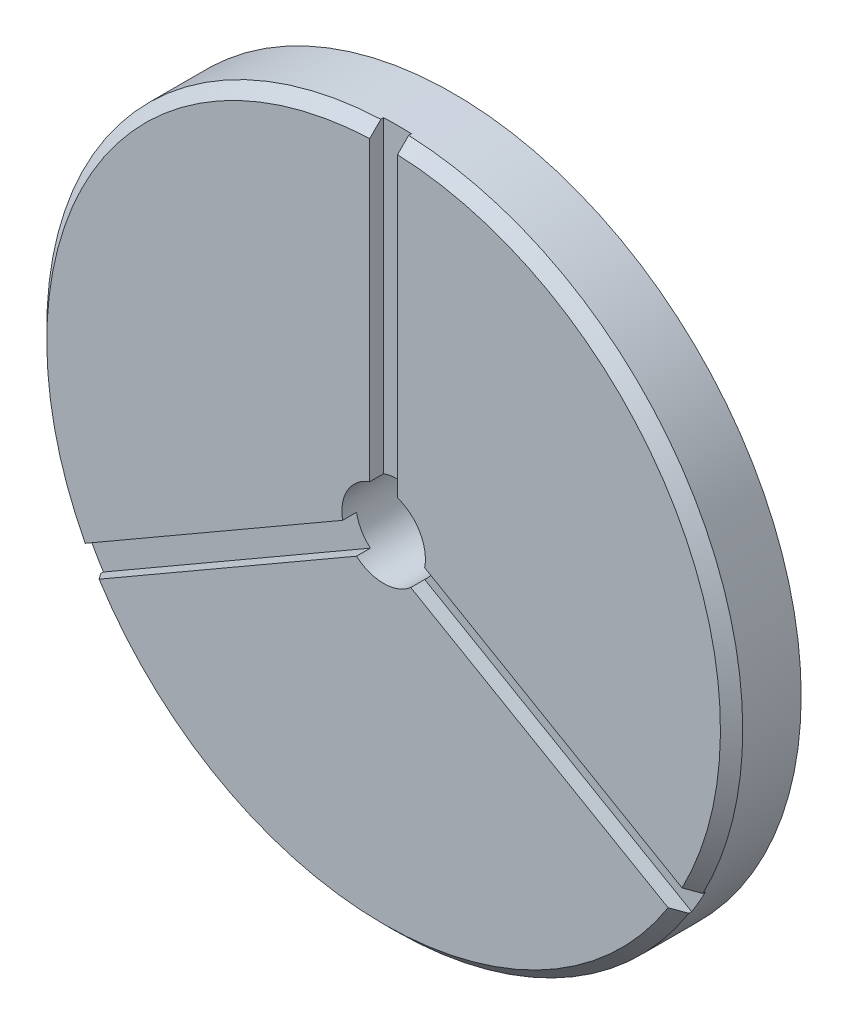
ISO-10303-21;
HEADER;
FILE_DESCRIPTION(('STEP AP214'),'2;1');
FILE_NAME('part.step','',(''),(''),'','','');
FILE_SCHEMA(('AUTOMOTIVE_DESIGN { 1 0 10303 214 1 1 1 1 }'));
ENDSEC;
DATA;
#1=APPLICATION_CONTEXT('core data for automotive mechanical design processes');
#2=APPLICATION_PROTOCOL_DEFINITION('international standard','automotive_design',2000,#1);
#3=PRODUCT_CONTEXT('',#1,'mechanical');
#4=PRODUCT('Part','Part','',(#3));
#5=PRODUCT_RELATED_PRODUCT_CATEGORY('part','',(#4));
#6=PRODUCT_DEFINITION_FORMATION('','',#4);
#7=PRODUCT_DEFINITION_CONTEXT('part definition',#1,'design');
#8=PRODUCT_DEFINITION('design','',#6,#7);
#9=PRODUCT_DEFINITION_SHAPE('','',#8);
#10=(LENGTH_UNIT() NAMED_UNIT(*) SI_UNIT(.MILLI.,.METRE.));
#11=(NAMED_UNIT(*) PLANE_ANGLE_UNIT() SI_UNIT($,.RADIAN.));
#12=(NAMED_UNIT(*) SI_UNIT($,.STERADIAN.) SOLID_ANGLE_UNIT());
#13=UNCERTAINTY_MEASURE_WITH_UNIT(LENGTH_MEASURE(1.E-05),#10,'distance_accuracy_value','');
#14=(GEOMETRIC_REPRESENTATION_CONTEXT(3) GLOBAL_UNCERTAINTY_ASSIGNED_CONTEXT((#13)) GLOBAL_UNIT_ASSIGNED_CONTEXT((#10,
#11,#12)) REPRESENTATION_CONTEXT('',''));
#15=CARTESIAN_POINT('',(0.,0.,0.));
#16=DIRECTION('',(0.,0.,1.));
#17=DIRECTION('',(1.,0.,0.));
#18=AXIS2_PLACEMENT_3D('',#15,#16,#17);
#19=CARTESIAN_POINT('',(0.,0.,0.));
#20=DIRECTION('',(0.,0.,-1.));
#21=DIRECTION('',(0.5,0.866025403784438,0.));
#22=AXIS2_PLACEMENT_3D('',#19,#20,#21);
#23=PLANE('',#22);
#24=DIRECTION('',(0.,-1.,0.));
#25=VECTOR('',#24,1.);
#26=CARTESIAN_POINT('',(-10.,249.799919935936,0.));
#27=LINE('',#26,#25);
#28=CARTESIAN_POINT('',(-10.,249.799919935936,0.));
#29=VERTEX_POINT('',#28);
#30=CARTESIAN_POINT('',(-10.,28.2842712474619,0.));
#31=VERTEX_POINT('',#30);
#32=EDGE_CURVE('E173',#29,#31,#27,.T.);
#33=ORIENTED_EDGE('',*,*,#32,.T.);
#34=CARTESIAN_POINT('',(0.,0.,0.));
#35=DIRECTION('',(0.,0.,1.));
#36=DIRECTION('',(1.,0.,0.));
#37=AXIS2_PLACEMENT_3D('',#34,#35,#36);
#38=CIRCLE('',#37,30.);
#39=CARTESIAN_POINT('',(10.,28.2842712474619,0.));
#40=VERTEX_POINT('',#39);
#41=EDGE_CURVE('E166',#40,#31,#38,.T.);
#42=ORIENTED_EDGE('',*,*,#41,.F.);
#43=DIRECTION('',(0.,1.,0.));
#44=VECTOR('',#43,1.);
#45=CARTESIAN_POINT('',(10.,28.2842712474619,0.));
#46=LINE('',#45,#44);
#47=CARTESIAN_POINT('',(10.,249.799919935936,0.));
#48=VERTEX_POINT('',#47);
#49=EDGE_CURVE('E170',#40,#48,#46,.T.);
#50=ORIENTED_EDGE('',*,*,#49,.T.);
#51=CARTESIAN_POINT('',(0.,0.,0.));
#52=DIRECTION('',(0.,0.,1.));
#53=DIRECTION('',(1.,0.,0.));
#54=AXIS2_PLACEMENT_3D('',#51,#52,#53);
#55=CIRCLE('',#54,250.);
#56=EDGE_CURVE('E198',#48,#29,#55,.T.);
#57=ORIENTED_EDGE('',*,*,#56,.T.);
#58=EDGE_LOOP('',(#33,#42,#50,#57));
#59=FACE_BOUND('',#58,.T.);
#60=ADVANCED_FACE('F17',(#59),#23,.F.);
#61=DIRECTION('',(-0.866025403784438,0.5,0.));
#62=VECTOR('',#61,1.);
#63=CARTESIAN_POINT('',(221.333076527839,-116.239705930124,0.));
#64=LINE('',#63,#62);
#65=CARTESIAN_POINT('',(221.333076527839,-116.239705930124,0.));
#66=VERTEX_POINT('',#65);
#67=CARTESIAN_POINT('',(29.4948974278318,-5.48188158588659,0.));
#68=VERTEX_POINT('',#67);
#69=EDGE_CURVE('E261',#66,#68,#64,.T.);
#70=ORIENTED_EDGE('',*,*,#69,.T.);
#71=CARTESIAN_POINT('',(19.4948974278317,-22.8023896615754,0.));
#72=VERTEX_POINT('',#71);
#73=EDGE_CURVE('E180',#72,#68,#38,.T.);
#74=ORIENTED_EDGE('',*,*,#73,.F.);
#75=DIRECTION('',(0.866025403784438,-0.5,0.));
#76=VECTOR('',#75,1.);
#77=CARTESIAN_POINT('',(19.4948974278317,-22.8023896615754,0.));
#78=LINE('',#77,#76);
#79=CARTESIAN_POINT('',(211.333076527839,-133.560214005812,0.));
#80=VERTEX_POINT('',#79);
#81=EDGE_CURVE('E255',#72,#80,#78,.T.);
#82=ORIENTED_EDGE('',*,*,#81,.T.);
#83=CARTESIAN_POINT('',(0.,0.,0.));
#84=DIRECTION('',(0.,0.,1.));
#85=DIRECTION('',(-0.5,-0.866025403784438,0.));
#86=AXIS2_PLACEMENT_3D('',#83,#84,#85);
#87=CIRCLE('',#86,250.);
#88=EDGE_CURVE('E269',#80,#66,#87,.T.);
#89=ORIENTED_EDGE('',*,*,#88,.T.);
#90=EDGE_LOOP('',(#70,#74,#82,#89));
#91=FACE_BOUND('',#90,.T.);
#92=ADVANCED_FACE('F416',(#91),#23,.F.);
#93=CARTESIAN_POINT('',(0.,0.,10.));
#94=DIRECTION('',(0.,0.,1.));
#95=DIRECTION('',(1.,0.,0.));
#96=AXIS2_PLACEMENT_3D('',#93,#94,#95);
#97=PLANE('',#96);
#98=DIRECTION('',(0.866025403784438,-0.5,0.));
#99=VECTOR('',#98,1.);
#100=CARTESIAN_POINT('',(19.4948974278317,-22.8023896615754,10.));
#101=LINE('',#100,#99);
#102=CARTESIAN_POINT('',(19.4948974278317,-22.8023896615754,10.));
#103=VERTEX_POINT('',#102);
#104=CARTESIAN_POINT('',(204.399140399382,-129.556904115504,10.));
#105=VERTEX_POINT('',#104);
#106=EDGE_CURVE('E256',#103,#105,#101,.T.);
#107=ORIENTED_EDGE('',*,*,#106,.F.);
#108=CARTESIAN_POINT('',(0.,0.,10.));
#109=DIRECTION('',(0.,0.,1.));
#110=DIRECTION('',(1.,0.,0.));
#111=AXIS2_PLACEMENT_3D('',#108,#109,#110);
#112=CIRCLE('',#111,30.);
#113=CARTESIAN_POINT('',(-19.4948974278318,-22.8023896615754,10.));
#114=VERTEX_POINT('',#113);
#115=EDGE_CURVE('E205',#114,#103,#112,.T.);
#116=ORIENTED_EDGE('',*,*,#115,.F.);
#117=DIRECTION('',(0.866025403784439,0.5,0.));
#118=VECTOR('',#117,1.);
#119=CARTESIAN_POINT('',(-211.333076527839,-133.560214005812,10.));
#120=LINE('',#119,#118);
#121=CARTESIAN_POINT('',(-204.399140399382,-129.556904115504,10.));
#122=VERTEX_POINT('',#121);
#123=EDGE_CURVE('E226',#122,#114,#120,.T.);
#124=ORIENTED_EDGE('',*,*,#123,.F.);
#125=CARTESIAN_POINT('',(0.,0.,10.));
#126=DIRECTION('',(0.,0.,1.));
#127=DIRECTION('',(1.,0.,0.));
#128=AXIS2_PLACEMENT_3D('',#125,#126,#127);
#129=CIRCLE('',#128,242.);
#130=EDGE_CURVE('E296',#122,#105,#129,.T.);
#131=ORIENTED_EDGE('',*,*,#130,.T.);
#132=EDGE_LOOP('',(#107,#116,#124,#131));
#133=FACE_BOUND('',#132,.T.);
#134=ADVANCED_FACE('F421',(#133),#97,.T.);
#135=DIRECTION('',(-0.866025403784439,-0.5,0.));
#136=VECTOR('',#135,1.);
#137=CARTESIAN_POINT('',(-29.4948974278318,-5.48188158588656,10.));
#138=LINE('',#137,#136);
#139=CARTESIAN_POINT('',(-29.4948974278318,-5.48188158588656,10.));
#140=VERTEX_POINT('',#139);
#141=CARTESIAN_POINT('',(-214.399140399382,-112.236396039815,10.));
#142=VERTEX_POINT('',#141);
#143=EDGE_CURVE('E222',#140,#142,#138,.T.);
#144=ORIENTED_EDGE('',*,*,#143,.F.);
#145=CARTESIAN_POINT('',(-10.,28.2842712474619,10.));
#146=VERTEX_POINT('',#145);
#147=EDGE_CURVE('E199',#146,#140,#112,.T.);
#148=ORIENTED_EDGE('',*,*,#147,.F.);
#149=DIRECTION('',(0.,-1.,0.));
#150=VECTOR('',#149,1.);
#151=CARTESIAN_POINT('',(-10.,249.799919935936,10.));
#152=LINE('',#151,#150);
#153=CARTESIAN_POINT('',(-10.,241.793300155318,10.));
#154=VERTEX_POINT('',#153);
#155=EDGE_CURVE('E208',#154,#146,#152,.T.);
#156=ORIENTED_EDGE('',*,*,#155,.F.);
#157=CARTESIAN_POINT('',(0.,0.,10.));
#158=DIRECTION('',(0.,0.,1.));
#159=DIRECTION('',(1.,0.,0.));
#160=AXIS2_PLACEMENT_3D('',#157,#158,#159);
#161=CIRCLE('',#160,242.);
#162=EDGE_CURVE('E300',#154,#142,#161,.T.);
#163=ORIENTED_EDGE('',*,*,#162,.T.);
#164=EDGE_LOOP('',(#144,#148,#156,#163));
#165=FACE_BOUND('',#164,.T.);
#166=ADVANCED_FACE('F441',(#165),#97,.T.);
#167=DIRECTION('',(0.,1.,0.));
#168=VECTOR('',#167,1.);
#169=CARTESIAN_POINT('',(10.,28.2842712474619,10.));
#170=LINE('',#169,#168);
#171=CARTESIAN_POINT('',(10.,28.2842712474619,10.));
#172=VERTEX_POINT('',#171);
#173=CARTESIAN_POINT('',(10.,241.793300155318,10.));
#174=VERTEX_POINT('',#173);
#175=EDGE_CURVE('E213',#172,#174,#170,.T.);
#176=ORIENTED_EDGE('',*,*,#175,.F.);
#177=CARTESIAN_POINT('',(29.4948974278318,-5.48188158588658,10.));
#178=VERTEX_POINT('',#177);
#179=EDGE_CURVE('E187',#178,#172,#112,.T.);
#180=ORIENTED_EDGE('',*,*,#179,.F.);
#181=DIRECTION('',(-0.866025403784438,0.5,0.));
#182=VECTOR('',#181,1.);
#183=CARTESIAN_POINT('',(221.333076527839,-116.239705930124,10.));
#184=LINE('',#183,#182);
#185=CARTESIAN_POINT('',(214.399140399382,-112.236396039815,10.));
#186=VERTEX_POINT('',#185);
#187=EDGE_CURVE('E260',#186,#178,#184,.T.);
#188=ORIENTED_EDGE('',*,*,#187,.F.);
#189=CARTESIAN_POINT('',(0.,0.,10.));
#190=DIRECTION('',(0.,0.,1.));
#191=DIRECTION('',(1.,0.,0.));
#192=AXIS2_PLACEMENT_3D('',#189,#190,#191);
#193=CIRCLE('',#192,242.);
#194=EDGE_CURVE('E292',#186,#174,#193,.T.);
#195=ORIENTED_EDGE('',*,*,#194,.T.);
#196=EDGE_LOOP('',(#176,#180,#188,#195));
#197=FACE_BOUND('',#196,.T.);
#198=ADVANCED_FACE('F396',(#197),#97,.T.);
#199=CARTESIAN_POINT('',(0.,0.,-40.));
#200=DIRECTION('',(0.,0.,1.));
#201=DIRECTION('',(1.,0.,0.));
#202=AXIS2_PLACEMENT_3D('',#199,#200,#201);
#203=CYLINDRICAL_SURFACE('',#202,250.);
#204=CARTESIAN_POINT('',(0.,0.,-40.));
#205=DIRECTION('',(0.,0.,1.));
#206=DIRECTION('',(1.,0.,0.));
#207=AXIS2_PLACEMENT_3D('',#204,#205,#206);
#208=CIRCLE('',#207,250.);
#209=CARTESIAN_POINT('',(250.,0.,-40.));
#210=VERTEX_POINT('',#209);
#211=EDGE_CURVE('E288',#210,#210,#208,.T.);
#212=ORIENTED_EDGE('',*,*,#211,.T.);
#213=EDGE_LOOP('',(#212));
#214=FACE_BOUND('',#213,.T.);
#215=DIRECTION('',(0.,0.,-1.));
#216=VECTOR('',#215,1.);
#217=CARTESIAN_POINT('',(-221.333076527839,-116.239705930123,10.));
#218=LINE('',#217,#216);
#219=CARTESIAN_POINT('',(-221.333076527839,-116.239705930123,2.));
#220=VERTEX_POINT('',#219);
#221=CARTESIAN_POINT('',(-221.333076527839,-116.239705930123,0.));
#222=VERTEX_POINT('',#221);
#223=EDGE_CURVE('E248',#220,#222,#218,.T.);
#224=ORIENTED_EDGE('',*,*,#223,.F.);
#225=CARTESIAN_POINT('',(0.,0.,2.));
#226=DIRECTION('',(0.,0.,1.));
#227=DIRECTION('',(1.,0.,0.));
#228=AXIS2_PLACEMENT_3D('',#225,#226,#227);
#229=CIRCLE('',#228,250.);
#230=CARTESIAN_POINT('',(-10.,249.799919935936,2.));
#231=VERTEX_POINT('',#230);
#232=EDGE_CURVE('E44',#220,#231,#229,.F.);
#233=ORIENTED_EDGE('',*,*,#232,.T.);
#234=DIRECTION('',(0.,0.,-1.));
#235=VECTOR('',#234,1.);
#236=CARTESIAN_POINT('',(-10.,249.799919935936,10.));
#237=LINE('',#236,#235);
#238=EDGE_CURVE('E217',#231,#29,#237,.T.);
#239=ORIENTED_EDGE('',*,*,#238,.T.);
#240=ORIENTED_EDGE('',*,*,#56,.F.);
#241=DIRECTION('',(0.,0.,-1.));
#242=VECTOR('',#241,1.);
#243=CARTESIAN_POINT('',(10.,249.799919935936,10.));
#244=LINE('',#243,#242);
#245=CARTESIAN_POINT('',(10.,249.799919935936,2.));
#246=VERTEX_POINT('',#245);
#247=EDGE_CURVE('E193',#246,#48,#244,.T.);
#248=ORIENTED_EDGE('',*,*,#247,.F.);
#249=CARTESIAN_POINT('',(0.,0.,2.));
#250=DIRECTION('',(0.,0.,1.));
#251=DIRECTION('',(1.,0.,0.));
#252=AXIS2_PLACEMENT_3D('',#249,#250,#251);
#253=CIRCLE('',#252,250.);
#254=CARTESIAN_POINT('',(221.333076527839,-116.239705930124,2.));
#255=VERTEX_POINT('',#254);
#256=EDGE_CURVE('E313',#246,#255,#253,.F.);
#257=ORIENTED_EDGE('',*,*,#256,.T.);
#258=DIRECTION('',(0.,0.,-1.));
#259=VECTOR('',#258,1.);
#260=CARTESIAN_POINT('',(221.333076527839,-116.239705930124,10.));
#261=LINE('',#260,#259);
#262=EDGE_CURVE('E279',#255,#66,#261,.T.);
#263=ORIENTED_EDGE('',*,*,#262,.T.);
#264=ORIENTED_EDGE('',*,*,#88,.F.);
#265=DIRECTION('',(0.,0.,-1.));
#266=VECTOR('',#265,1.);
#267=CARTESIAN_POINT('',(211.333076527839,-133.560214005812,10.));
#268=LINE('',#267,#266);
#269=CARTESIAN_POINT('',(211.333076527839,-133.560214005812,2.));
#270=VERTEX_POINT('',#269);
#271=EDGE_CURVE('E282',#270,#80,#268,.T.);
#272=ORIENTED_EDGE('',*,*,#271,.F.);
#273=CARTESIAN_POINT('',(0.,0.,2.));
#274=DIRECTION('',(0.,0.,1.));
#275=DIRECTION('',(1.,0.,0.));
#276=AXIS2_PLACEMENT_3D('',#273,#274,#275);
#277=CIRCLE('',#276,250.);
#278=CARTESIAN_POINT('',(-211.333076527839,-133.560214005812,2.00000000000003));
#279=VERTEX_POINT('',#278);
#280=EDGE_CURVE('E53',#270,#279,#277,.F.);
#281=ORIENTED_EDGE('',*,*,#280,.T.);
#282=DIRECTION('',(0.,0.,-1.));
#283=VECTOR('',#282,1.);
#284=CARTESIAN_POINT('',(-211.333076527839,-133.560214005812,10.));
#285=LINE('',#284,#283);
#286=CARTESIAN_POINT('',(-211.333076527839,-133.560214005812,0.));
#287=VERTEX_POINT('',#286);
#288=EDGE_CURVE('E245',#279,#287,#285,.T.);
#289=ORIENTED_EDGE('',*,*,#288,.T.);
#290=CARTESIAN_POINT('',(0.,0.,0.));
#291=DIRECTION('',(0.,0.,1.));
#292=DIRECTION('',(-0.5,0.866025403784439,0.));
#293=AXIS2_PLACEMENT_3D('',#290,#291,#292);
#294=CIRCLE('',#293,250.);
#295=EDGE_CURVE('E235',#222,#287,#294,.T.);
#296=ORIENTED_EDGE('',*,*,#295,.F.);
#297=EDGE_LOOP('',(#224,#233,#239,#240,#248,#257,#263,#264,#272,#281,#289,#296));
#298=FACE_BOUND('',#297,.T.);
#299=ADVANCED_FACE('F326',(#214,#298),#203,.T.);
#300=CARTESIAN_POINT('',(0.,0.,-40.));
#301=DIRECTION('',(0.,0.,1.));
#302=DIRECTION('',(1.,0.,0.));
#303=AXIS2_PLACEMENT_3D('',#300,#301,#302);
#304=PLANE('',#303);
#305=CARTESIAN_POINT('',(0.,0.,-40.));
#306=DIRECTION('',(0.,0.,1.));
#307=DIRECTION('',(1.,0.,0.));
#308=AXIS2_PLACEMENT_3D('',#305,#306,#307);
#309=CIRCLE('',#308,30.);
#310=CARTESIAN_POINT('',(30.,0.,-40.));
#311=VERTEX_POINT('',#310);
#312=EDGE_CURVE('E177',#311,#311,#309,.T.);
#313=ORIENTED_EDGE('',*,*,#312,.T.);
#314=EDGE_LOOP('',(#313));
#315=FACE_BOUND('',#314,.T.);
#316=ORIENTED_EDGE('',*,*,#211,.F.);
#317=EDGE_LOOP('',(#316));
#318=FACE_BOUND('',#317,.T.);
#319=ADVANCED_FACE('F408',(#315,#318),#304,.F.);
#320=CARTESIAN_POINT('',(19.4948974278317,-22.8023896615754,10.));
#321=DIRECTION('',(0.5,0.866025403784438,0.));
#322=DIRECTION('',(-0.866025403784438,0.5,0.));
#323=AXIS2_PLACEMENT_3D('',#320,#321,#322);
#324=PLANE('',#323);
#325=ORIENTED_EDGE('',*,*,#106,.T.);
#326=CARTESIAN_POINT('',(204.399140399382,-129.556904115504,10.));
#327=CARTESIAN_POINT('',(205.554811963524,-130.224131404156,8.66668462871758));
#328=CARTESIAN_POINT('',(206.710475756301,-130.891354206008,7.33336027640922));
#329=CARTESIAN_POINT('',(209.02178779912,-132.225790836111,4.66669360974255));
#330=CARTESIAN_POINT('',(210.177436049163,-132.893004664362,3.33335129538425));
#331=CARTESIAN_POINT('',(211.333076527839,-133.560214005812,2.));
#332=B_SPLINE_CURVE_WITH_KNOTS('',3,(#326,#327,#328,#329,#330,#331),.UNSPECIFIED.,.F.,.F.,(4,2,
4),(0.,5.65919517947052,11.3183903589327),.UNSPECIFIED.);
#333=EDGE_CURVE('E340',#105,#270,#332,.T.);
#334=ORIENTED_EDGE('',*,*,#333,.T.);
#335=ORIENTED_EDGE('',*,*,#271,.T.);
#336=ORIENTED_EDGE('',*,*,#81,.F.);
#337=DIRECTION('',(0.,0.,-1.));
#338=VECTOR('',#337,1.);
#339=CARTESIAN_POINT('',(19.4948974278317,-22.8023896615754,10.));
#340=LINE('',#339,#338);
#341=EDGE_CURVE('E285',#103,#72,#340,.T.);
#342=ORIENTED_EDGE('',*,*,#341,.F.);
#343=EDGE_LOOP('',(#325,#334,#335,#336,#342));
#344=FACE_BOUND('',#343,.T.);
#345=ADVANCED_FACE('F374',(#344),#324,.T.);
#346=CARTESIAN_POINT('',(221.333076527839,-116.239705930124,10.));
#347=DIRECTION('',(-0.5,-0.866025403784438,0.));
#348=DIRECTION('',(0.866025403784438,-0.5,0.));
#349=AXIS2_PLACEMENT_3D('',#346,#347,#348);
#350=PLANE('',#349);
#351=ORIENTED_EDGE('',*,*,#262,.F.);
#352=CARTESIAN_POINT('',(221.333076527839,-116.239705930124,2.));
#353=CARTESIAN_POINT('',(220.177436049163,-115.572496588673,3.33335129538425));
#354=CARTESIAN_POINT('',(219.02178779912,-114.905282760422,4.66669360974254));
#355=CARTESIAN_POINT('',(216.710475756301,-113.57084613032,7.33336027640921));
#356=CARTESIAN_POINT('',(215.554811963524,-112.903623328467,8.66668462871758));
#357=CARTESIAN_POINT('',(214.399140399382,-112.236396039815,10.));
#358=B_SPLINE_CURVE_WITH_KNOTS('',3,(#352,#353,#354,#355,#356,#357),.UNSPECIFIED.,.F.,.F.,(4,2,
4),(0.,5.65919517946218,11.3183903589327),.UNSPECIFIED.);
#359=EDGE_CURVE('E11',#255,#186,#358,.T.);
#360=ORIENTED_EDGE('',*,*,#359,.T.);
#361=ORIENTED_EDGE('',*,*,#187,.T.);
#362=DIRECTION('',(0.,0.,-1.));
#363=VECTOR('',#362,1.);
#364=CARTESIAN_POINT('',(29.4948974278318,-5.4818815858866,10.));
#365=LINE('',#364,#363);
#366=EDGE_CURVE('E265',#178,#68,#365,.T.);
#367=ORIENTED_EDGE('',*,*,#366,.T.);
#368=ORIENTED_EDGE('',*,*,#69,.F.);
#369=EDGE_LOOP('',(#351,#360,#361,#367,#368));
#370=FACE_BOUND('',#369,.T.);
#371=ADVANCED_FACE('F392',(#370),#350,.T.);
#372=DIRECTION('',(0.866025403784439,0.5,0.));
#373=VECTOR('',#372,1.);
#374=CARTESIAN_POINT('',(-211.333076527839,-133.560214005812,0.));
#375=LINE('',#374,#373);
#376=CARTESIAN_POINT('',(-19.4948974278318,-22.8023896615753,0.));
#377=VERTEX_POINT('',#376);
#378=EDGE_CURVE('E227',#287,#377,#375,.T.);
#379=ORIENTED_EDGE('',*,*,#378,.T.);
#380=CARTESIAN_POINT('',(-29.4948974278318,-5.48188158588656,0.));
#381=VERTEX_POINT('',#380);
#382=EDGE_CURVE('E178',#381,#377,#38,.T.);
#383=ORIENTED_EDGE('',*,*,#382,.F.);
#384=DIRECTION('',(-0.866025403784439,-0.5,0.));
#385=VECTOR('',#384,1.);
#386=CARTESIAN_POINT('',(-29.4948974278318,-5.48188158588656,0.));
#387=LINE('',#386,#385);
#388=EDGE_CURVE('E192',#381,#222,#387,.T.);
#389=ORIENTED_EDGE('',*,*,#388,.T.);
#390=ORIENTED_EDGE('',*,*,#295,.T.);
#391=EDGE_LOOP('',(#379,#383,#389,#390));
#392=FACE_BOUND('',#391,.T.);
#393=ADVANCED_FACE('F417',(#392),#23,.F.);
#394=CARTESIAN_POINT('',(-29.4948974278318,-5.48188158588656,10.));
#395=DIRECTION('',(0.5,-0.866025403784439,0.));
#396=DIRECTION('',(0.866025403784439,0.5,0.));
#397=AXIS2_PLACEMENT_3D('',#394,#395,#396);
#398=PLANE('',#397);
#399=ORIENTED_EDGE('',*,*,#143,.T.);
#400=CARTESIAN_POINT('',(-214.399140399382,-112.236396039815,10.));
#401=CARTESIAN_POINT('',(-215.554811963524,-112.903623328467,8.66668462871753));
#402=CARTESIAN_POINT('',(-216.710475756301,-113.57084613032,7.33336027640914));
#403=CARTESIAN_POINT('',(-219.02178779912,-114.905282760422,4.66669360974247));
#404=CARTESIAN_POINT('',(-220.177436049163,-115.572496588673,3.3333512953842));
#405=CARTESIAN_POINT('',(-221.333076527839,-116.239705930123,2.));
#406=B_SPLINE_CURVE_WITH_KNOTS('',3,(#400,#401,#402,#403,#404,#405),.UNSPECIFIED.,.F.,.F.,(4,2,
4),(0.,5.65919517947033,11.3183903589323),.UNSPECIFIED.);
#407=EDGE_CURVE('E304',#142,#220,#406,.T.);
#408=ORIENTED_EDGE('',*,*,#407,.T.);
#409=ORIENTED_EDGE('',*,*,#223,.T.);
#410=ORIENTED_EDGE('',*,*,#388,.F.);
#411=DIRECTION('',(0.,0.,-1.));
#412=VECTOR('',#411,1.);
#413=CARTESIAN_POINT('',(-29.4948974278318,-5.48188158588656,10.));
#414=LINE('',#413,#412);
#415=EDGE_CURVE('E251',#140,#381,#414,.T.);
#416=ORIENTED_EDGE('',*,*,#415,.F.);
#417=EDGE_LOOP('',(#399,#408,#409,#410,#416));
#418=FACE_BOUND('',#417,.T.);
#419=ADVANCED_FACE('F315',(#418),#398,.T.);
#420=CARTESIAN_POINT('',(-211.333076527839,-133.560214005812,10.));
#421=DIRECTION('',(-0.5,0.866025403784439,0.));
#422=DIRECTION('',(-0.866025403784439,-0.5,0.));
#423=AXIS2_PLACEMENT_3D('',#420,#421,#422);
#424=PLANE('',#423);
#425=ORIENTED_EDGE('',*,*,#288,.F.);
#426=CARTESIAN_POINT('',(-211.333076527839,-133.560214005812,2.));
#427=CARTESIAN_POINT('',(-210.177436049163,-132.893004664362,3.33335129538421));
#428=CARTESIAN_POINT('',(-209.02178779912,-132.225790836111,4.66669360974249));
#429=CARTESIAN_POINT('',(-206.710475756301,-130.891354206008,7.33336027640916));
#430=CARTESIAN_POINT('',(-205.554811963524,-130.224131404156,8.66668462871755));
#431=CARTESIAN_POINT('',(-204.399140399382,-129.556904115504,10.));
#432=B_SPLINE_CURVE_WITH_KNOTS('',3,(#426,#427,#428,#429,#430,#431),.UNSPECIFIED.,.F.,.F.,(4,2,
4),(0.,5.65919517946203,11.3183903589324),.UNSPECIFIED.);
#433=EDGE_CURVE('E361',#279,#122,#432,.T.);
#434=ORIENTED_EDGE('',*,*,#433,.T.);
#435=ORIENTED_EDGE('',*,*,#123,.T.);
#436=DIRECTION('',(0.,0.,-1.));
#437=VECTOR('',#436,1.);
#438=CARTESIAN_POINT('',(-19.4948974278318,-22.8023896615754,10.));
#439=LINE('',#438,#437);
#440=EDGE_CURVE('E231',#114,#377,#439,.T.);
#441=ORIENTED_EDGE('',*,*,#440,.T.);
#442=ORIENTED_EDGE('',*,*,#378,.F.);
#443=EDGE_LOOP('',(#425,#434,#435,#441,#442));
#444=FACE_BOUND('',#443,.T.);
#445=ADVANCED_FACE('F354',(#444),#424,.T.);
#446=CARTESIAN_POINT('',(10.,28.2842712474619,10.));
#447=DIRECTION('',(-1.,0.,0.));
#448=DIRECTION('',(0.,-1.,0.));
#449=AXIS2_PLACEMENT_3D('',#446,#447,#448);
#450=PLANE('',#449);
#451=ORIENTED_EDGE('',*,*,#175,.T.);
#452=CARTESIAN_POINT('',(10.,241.793300155318,10.));
#453=CARTESIAN_POINT('',(10.,243.127754732623,8.66668462871758));
#454=CARTESIAN_POINT('',(10.,244.462200336328,7.33336027640921));
#455=CARTESIAN_POINT('',(10.,247.131073596534,4.66669360974255));
#456=CARTESIAN_POINT('',(10.,248.465501253035,3.33335129538425));
#457=CARTESIAN_POINT('',(10.,249.799919935936,2.));
#458=B_SPLINE_CURVE_WITH_KNOTS('',3,(#452,#453,#454,#455,#456,#457),.UNSPECIFIED.,.F.,.F.,(4,2,
4),(0.,5.65919517947045,11.3183903589326),.UNSPECIFIED.);
#459=EDGE_CURVE('E32',#174,#246,#458,.T.);
#460=ORIENTED_EDGE('',*,*,#459,.T.);
#461=ORIENTED_EDGE('',*,*,#247,.T.);
#462=ORIENTED_EDGE('',*,*,#49,.F.);
#463=DIRECTION('',(0.,0.,-1.));
#464=VECTOR('',#463,1.);
#465=CARTESIAN_POINT('',(10.,28.2842712474619,10.));
#466=LINE('',#465,#464);
#467=EDGE_CURVE('E182',#172,#40,#466,.T.);
#468=ORIENTED_EDGE('',*,*,#467,.F.);
#469=EDGE_LOOP('',(#451,#460,#461,#462,#468));
#470=FACE_BOUND('',#469,.T.);
#471=ADVANCED_FACE('F195',(#470),#450,.T.);
#472=CARTESIAN_POINT('',(-10.,249.799919935936,10.));
#473=DIRECTION('',(1.,0.,0.));
#474=DIRECTION('',(0.,1.,0.));
#475=AXIS2_PLACEMENT_3D('',#472,#473,#474);
#476=PLANE('',#475);
#477=ORIENTED_EDGE('',*,*,#238,.F.);
#478=CARTESIAN_POINT('',(-10.,249.799919935936,2.));
#479=CARTESIAN_POINT('',(-10.,248.465501253035,3.33335129538425));
#480=CARTESIAN_POINT('',(-10.,247.131073596534,4.66669360974255));
#481=CARTESIAN_POINT('',(-10.,244.462200336328,7.33336027640921));
#482=CARTESIAN_POINT('',(-10.,243.127754732623,8.66668462871758));
#483=CARTESIAN_POINT('',(-10.,241.793300155318,10.));
#484=B_SPLINE_CURVE_WITH_KNOTS('',3,(#478,#479,#480,#481,#482,#483),.UNSPECIFIED.,.F.,.F.,(4,2,
4),(0.,5.65919517946214,11.3183903589326),.UNSPECIFIED.);
#485=EDGE_CURVE('E331',#231,#154,#484,.T.);
#486=ORIENTED_EDGE('',*,*,#485,.T.);
#487=ORIENTED_EDGE('',*,*,#155,.T.);
#488=DIRECTION('',(0.,0.,-1.));
#489=VECTOR('',#488,1.);
#490=CARTESIAN_POINT('',(-10.,28.2842712474619,10.));
#491=LINE('',#490,#489);
#492=EDGE_CURVE('E214',#146,#31,#491,.T.);
#493=ORIENTED_EDGE('',*,*,#492,.T.);
#494=ORIENTED_EDGE('',*,*,#32,.F.);
#495=EDGE_LOOP('',(#477,#486,#487,#493,#494));
#496=FACE_BOUND('',#495,.T.);
#497=ADVANCED_FACE('F324',(#496),#476,.T.);
#498=CARTESIAN_POINT('',(0.,0.,10.));
#499=DIRECTION('',(0.,0.,-1.));
#500=DIRECTION('',(-1.,0.,0.));
#501=AXIS2_PLACEMENT_3D('',#498,#499,#500);
#502=CONICAL_SURFACE('',#501,242.,0.785398163397449);
#503=ORIENTED_EDGE('',*,*,#485,.F.);
#504=ORIENTED_EDGE('',*,*,#232,.F.);
#505=ORIENTED_EDGE('',*,*,#407,.F.);
#506=ORIENTED_EDGE('',*,*,#162,.F.);
#507=EDGE_LOOP('',(#503,#504,#505,#506));
#508=FACE_BOUND('',#507,.T.);
#509=ADVANCED_FACE('F319',(#508),#502,.T.);
#510=CARTESIAN_POINT('',(0.,0.,10.));
#511=DIRECTION('',(0.,0.,-1.));
#512=DIRECTION('',(-1.,0.,0.));
#513=AXIS2_PLACEMENT_3D('',#510,#511,#512);
#514=CONICAL_SURFACE('',#513,242.,0.785398163397449);
#515=ORIENTED_EDGE('',*,*,#433,.F.);
#516=ORIENTED_EDGE('',*,*,#280,.F.);
#517=ORIENTED_EDGE('',*,*,#333,.F.);
#518=ORIENTED_EDGE('',*,*,#130,.F.);
#519=EDGE_LOOP('',(#515,#516,#517,#518));
#520=FACE_BOUND('',#519,.T.);
#521=ADVANCED_FACE('F323',(#520),#514,.T.);
#522=CARTESIAN_POINT('',(0.,0.,10.));
#523=DIRECTION('',(0.,0.,-1.));
#524=DIRECTION('',(-1.,0.,0.));
#525=AXIS2_PLACEMENT_3D('',#522,#523,#524);
#526=CONICAL_SURFACE('',#525,242.,0.785398163397449);
#527=ORIENTED_EDGE('',*,*,#359,.F.);
#528=ORIENTED_EDGE('',*,*,#256,.F.);
#529=ORIENTED_EDGE('',*,*,#459,.F.);
#530=ORIENTED_EDGE('',*,*,#194,.F.);
#531=EDGE_LOOP('',(#527,#528,#529,#530));
#532=FACE_BOUND('',#531,.T.);
#533=ADVANCED_FACE('F19',(#532),#526,.T.);
#534=CARTESIAN_POINT('',(0.,0.,10.));
#535=DIRECTION('',(0.,0.,-1.));
#536=DIRECTION('',(-1.,0.,0.));
#537=AXIS2_PLACEMENT_3D('',#534,#535,#536);
#538=CYLINDRICAL_SURFACE('',#537,30.);
#539=ORIENTED_EDGE('',*,*,#341,.T.);
#540=ORIENTED_EDGE('',*,*,#73,.T.);
#541=ORIENTED_EDGE('',*,*,#366,.F.);
#542=ORIENTED_EDGE('',*,*,#179,.T.);
#543=ORIENTED_EDGE('',*,*,#467,.T.);
#544=ORIENTED_EDGE('',*,*,#41,.T.);
#545=ORIENTED_EDGE('',*,*,#492,.F.);
#546=ORIENTED_EDGE('',*,*,#147,.T.);
#547=ORIENTED_EDGE('',*,*,#415,.T.);
#548=ORIENTED_EDGE('',*,*,#382,.T.);
#549=ORIENTED_EDGE('',*,*,#440,.F.);
#550=ORIENTED_EDGE('',*,*,#115,.T.);
#551=EDGE_LOOP('',(#539,#540,#541,#542,#543,#544,#545,#546,#547,#548,#549,#550));
#552=FACE_BOUND('',#551,.T.);
#553=ORIENTED_EDGE('',*,*,#312,.F.);
#554=EDGE_LOOP('',(#553));
#555=FACE_BOUND('',#554,.T.);
#556=ADVANCED_FACE('F184',(#552,#555),#538,.F.);
#557=CLOSED_SHELL('',(#60,#92,#134,#166,#198,#299,#319,#345,#371,#393,#419,#445,#471,#497,#509,
#521,#533,#556));
#558=MANIFOLD_SOLID_BREP('B1',#557);
#559=ADVANCED_BREP_SHAPE_REPRESENTATION('',(#18,#558),#14);
#560=SHAPE_DEFINITION_REPRESENTATION(#9,#559);
ENDSEC;
END-ISO-10303-21;
